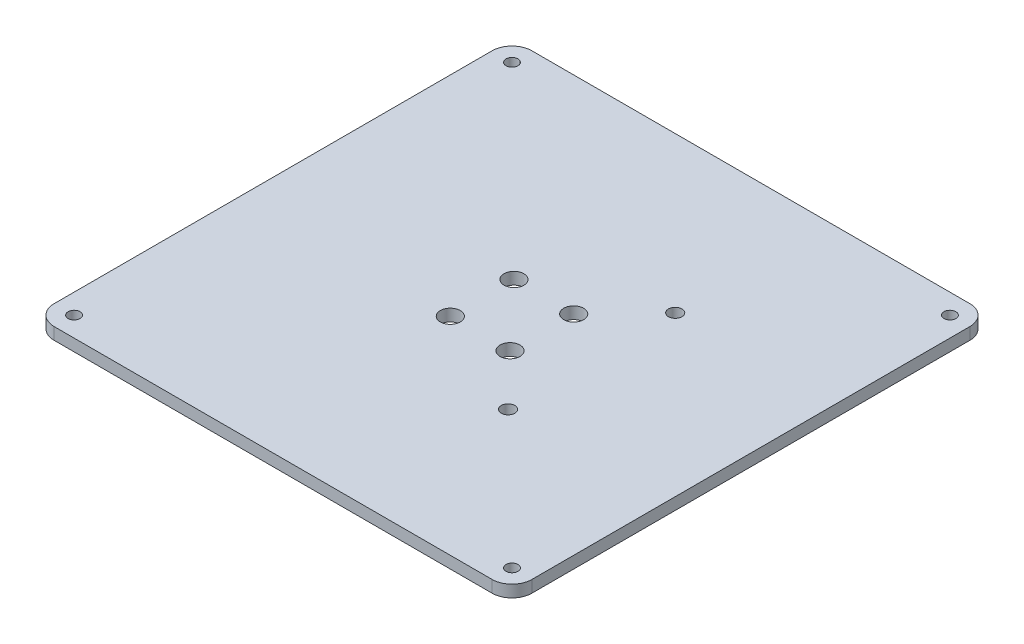
ISO-10303-21;
HEADER;
FILE_DESCRIPTION(('STEP AP214'),'2;1');
FILE_NAME('part.step','',(''),(''),'','','');
FILE_SCHEMA(('AUTOMOTIVE_DESIGN { 1 0 10303 214 1 1 1 1 }'));
ENDSEC;
DATA;
#1=APPLICATION_CONTEXT('core data for automotive mechanical design processes');
#2=APPLICATION_PROTOCOL_DEFINITION('international standard','automotive_design',2000,#1);
#3=PRODUCT_CONTEXT('',#1,'mechanical');
#4=PRODUCT('Part','Part','',(#3));
#5=PRODUCT_RELATED_PRODUCT_CATEGORY('part','',(#4));
#6=PRODUCT_DEFINITION_FORMATION('','',#4);
#7=PRODUCT_DEFINITION_CONTEXT('part definition',#1,'design');
#8=PRODUCT_DEFINITION('design','',#6,#7);
#9=PRODUCT_DEFINITION_SHAPE('','',#8);
#10=(LENGTH_UNIT() NAMED_UNIT(*) SI_UNIT(.MILLI.,.METRE.));
#11=(NAMED_UNIT(*) PLANE_ANGLE_UNIT() SI_UNIT($,.RADIAN.));
#12=(NAMED_UNIT(*) SI_UNIT($,.STERADIAN.) SOLID_ANGLE_UNIT());
#13=UNCERTAINTY_MEASURE_WITH_UNIT(LENGTH_MEASURE(1.E-05),#10,'distance_accuracy_value','');
#14=(GEOMETRIC_REPRESENTATION_CONTEXT(3) GLOBAL_UNCERTAINTY_ASSIGNED_CONTEXT((#13)) GLOBAL_UNIT_ASSIGNED_CONTEXT((#10,
#11,#12)) REPRESENTATION_CONTEXT('',''));
#15=CARTESIAN_POINT('',(0.,0.,0.));
#16=DIRECTION('',(0.,0.,1.));
#17=DIRECTION('',(1.,0.,0.));
#18=AXIS2_PLACEMENT_3D('',#15,#16,#17);
#19=CARTESIAN_POINT('',(0.,3.,0.));
#20=DIRECTION('',(0.,-1.,0.));
#21=DIRECTION('',(0.,0.,-1.));
#22=AXIS2_PLACEMENT_3D('',#19,#20,#21);
#23=PLANE('',#22);
#24=CARTESIAN_POINT('',(20.,3.,-21.));
#25=DIRECTION('',(0.,1.,0.));
#26=DIRECTION('',(0.,0.,1.));
#27=AXIS2_PLACEMENT_3D('',#24,#25,#26);
#28=CIRCLE('',#27,1.7);
#29=CARTESIAN_POINT('',(20.,3.,-19.3));
#30=VERTEX_POINT('',#29);
#31=EDGE_CURVE('E239',#30,#30,#28,.T.);
#32=ORIENTED_EDGE('',*,*,#31,.F.);
#33=EDGE_LOOP('',(#32));
#34=FACE_BOUND('',#33,.T.);
#35=CARTESIAN_POINT('',(20.,3.,21.));
#36=DIRECTION('',(0.,1.,0.));
#37=DIRECTION('',(0.,0.,1.));
#38=AXIS2_PLACEMENT_3D('',#35,#36,#37);
#39=CIRCLE('',#38,1.7);
#40=CARTESIAN_POINT('',(20.,3.,22.7));
#41=VERTEX_POINT('',#40);
#42=EDGE_CURVE('E236',#41,#41,#39,.T.);
#43=ORIENTED_EDGE('',*,*,#42,.F.);
#44=EDGE_LOOP('',(#43));
#45=FACE_BOUND('',#44,.T.);
#46=CARTESIAN_POINT('',(55.,3.,55.));
#47=DIRECTION('',(0.,1.,0.));
#48=DIRECTION('',(0.,0.,-1.));
#49=AXIS2_PLACEMENT_3D('',#46,#47,#48);
#50=CIRCLE('',#49,1.5);
#51=CARTESIAN_POINT('',(55.,3.,53.5));
#52=VERTEX_POINT('',#51);
#53=EDGE_CURVE('E227',#52,#52,#50,.T.);
#54=ORIENTED_EDGE('',*,*,#53,.F.);
#55=EDGE_LOOP('',(#54));
#56=FACE_BOUND('',#55,.T.);
#57=CARTESIAN_POINT('',(-55.,3.,55.));
#58=DIRECTION('',(0.,-1.,0.));
#59=DIRECTION('',(0.,0.,-1.));
#60=AXIS2_PLACEMENT_3D('',#57,#58,#59);
#61=CIRCLE('',#60,1.5);
#62=CARTESIAN_POINT('',(-55.,3.,53.5));
#63=VERTEX_POINT('',#62);
#64=EDGE_CURVE('E221',#63,#63,#61,.T.);
#65=ORIENTED_EDGE('',*,*,#64,.T.);
#66=EDGE_LOOP('',(#65));
#67=FACE_BOUND('',#66,.T.);
#68=CARTESIAN_POINT('',(55.,3.,-55.));
#69=DIRECTION('',(0.,-1.,0.));
#70=DIRECTION('',(0.,0.,1.));
#71=AXIS2_PLACEMENT_3D('',#68,#69,#70);
#72=CIRCLE('',#71,1.5);
#73=CARTESIAN_POINT('',(55.,3.,-53.5));
#74=VERTEX_POINT('',#73);
#75=EDGE_CURVE('E215',#74,#74,#72,.T.);
#76=ORIENTED_EDGE('',*,*,#75,.T.);
#77=EDGE_LOOP('',(#76));
#78=FACE_BOUND('',#77,.T.);
#79=CARTESIAN_POINT('',(-55.,3.,-55.));
#80=DIRECTION('',(0.,1.,0.));
#81=DIRECTION('',(0.,0.,1.));
#82=AXIS2_PLACEMENT_3D('',#79,#80,#81);
#83=CIRCLE('',#82,1.5);
#84=CARTESIAN_POINT('',(-55.,3.,-53.5));
#85=VERTEX_POINT('',#84);
#86=EDGE_CURVE('E209',#85,#85,#83,.T.);
#87=ORIENTED_EDGE('',*,*,#86,.F.);
#88=EDGE_LOOP('',(#87));
#89=FACE_BOUND('',#88,.T.);
#90=DIRECTION('',(-1.,0.,0.));
#91=VECTOR('',#90,1.);
#92=CARTESIAN_POINT('',(-60.,3.,-60.));
#93=LINE('',#92,#91);
#94=CARTESIAN_POINT('',(55.,3.,-60.));
#95=VERTEX_POINT('',#94);
#96=CARTESIAN_POINT('',(-55.,3.,-60.));
#97=VERTEX_POINT('',#96);
#98=EDGE_CURVE('E175',#95,#97,#93,.T.);
#99=ORIENTED_EDGE('',*,*,#98,.T.);
#100=CARTESIAN_POINT('',(-55.,3.,-55.));
#101=DIRECTION('',(0.,-1.,0.));
#102=DIRECTION('',(0.,0.,-1.));
#103=AXIS2_PLACEMENT_3D('',#100,#101,#102);
#104=CIRCLE('',#103,5.);
#105=CARTESIAN_POINT('',(-60.,3.,-55.));
#106=VERTEX_POINT('',#105);
#107=EDGE_CURVE('E153',#97,#106,#104,.F.);
#108=ORIENTED_EDGE('',*,*,#107,.T.);
#109=DIRECTION('',(0.,0.,1.));
#110=VECTOR('',#109,1.);
#111=CARTESIAN_POINT('',(-60.,3.,60.));
#112=LINE('',#111,#110);
#113=CARTESIAN_POINT('',(-60.,3.,55.));
#114=VERTEX_POINT('',#113);
#115=EDGE_CURVE('E123',#106,#114,#112,.T.);
#116=ORIENTED_EDGE('',*,*,#115,.T.);
#117=CARTESIAN_POINT('',(-55.,3.,55.));
#118=DIRECTION('',(0.,-1.,0.));
#119=DIRECTION('',(0.,0.,-1.));
#120=AXIS2_PLACEMENT_3D('',#117,#118,#119);
#121=CIRCLE('',#120,5.);
#122=CARTESIAN_POINT('',(-55.,3.,60.));
#123=VERTEX_POINT('',#122);
#124=EDGE_CURVE('E59',#114,#123,#121,.F.);
#125=ORIENTED_EDGE('',*,*,#124,.T.);
#126=DIRECTION('',(1.,0.,0.));
#127=VECTOR('',#126,1.);
#128=CARTESIAN_POINT('',(-60.,3.,60.));
#129=LINE('',#128,#127);
#130=CARTESIAN_POINT('',(55.,3.,60.));
#131=VERTEX_POINT('',#130);
#132=EDGE_CURVE('E139',#123,#131,#129,.T.);
#133=ORIENTED_EDGE('',*,*,#132,.T.);
#134=CARTESIAN_POINT('',(55.,3.,55.));
#135=DIRECTION('',(0.,-1.,0.));
#136=DIRECTION('',(0.,0.,-1.));
#137=AXIS2_PLACEMENT_3D('',#134,#135,#136);
#138=CIRCLE('',#137,5.);
#139=CARTESIAN_POINT('',(60.,3.,55.));
#140=VERTEX_POINT('',#139);
#141=EDGE_CURVE('E149',#131,#140,#138,.F.);
#142=ORIENTED_EDGE('',*,*,#141,.T.);
#143=DIRECTION('',(0.,0.,-1.));
#144=VECTOR('',#143,1.);
#145=CARTESIAN_POINT('',(60.,3.,60.));
#146=LINE('',#145,#144);
#147=CARTESIAN_POINT('',(60.,3.,-55.));
#148=VERTEX_POINT('',#147);
#149=EDGE_CURVE('E133',#140,#148,#146,.T.);
#150=ORIENTED_EDGE('',*,*,#149,.T.);
#151=CARTESIAN_POINT('',(55.,3.,-55.));
#152=DIRECTION('',(0.,-1.,0.));
#153=DIRECTION('',(0.,0.,-1.));
#154=AXIS2_PLACEMENT_3D('',#151,#152,#153);
#155=CIRCLE('',#154,5.);
#156=EDGE_CURVE('E151',#148,#95,#155,.F.);
#157=ORIENTED_EDGE('',*,*,#156,.T.);
#158=EDGE_LOOP('',(#99,#108,#116,#125,#133,#142,#150,#157));
#159=FACE_BOUND('',#158,.T.);
#160=CARTESIAN_POINT('',(-7.5,3.,8.));
#161=DIRECTION('',(0.,1.,0.));
#162=DIRECTION('',(0.,0.,1.));
#163=AXIS2_PLACEMENT_3D('',#160,#161,#162);
#164=CIRCLE('',#163,2.5);
#165=CARTESIAN_POINT('',(-7.5,3.,10.5));
#166=VERTEX_POINT('',#165);
#167=EDGE_CURVE('E184',#166,#166,#164,.T.);
#168=ORIENTED_EDGE('',*,*,#167,.F.);
#169=EDGE_LOOP('',(#168));
#170=FACE_BOUND('',#169,.T.);
#171=CARTESIAN_POINT('',(7.5,3.,-8.));
#172=DIRECTION('',(0.,1.,0.));
#173=DIRECTION('',(0.,0.,1.));
#174=AXIS2_PLACEMENT_3D('',#171,#172,#173);
#175=CIRCLE('',#174,2.5);
#176=CARTESIAN_POINT('',(7.5,3.,-5.5));
#177=VERTEX_POINT('',#176);
#178=EDGE_CURVE('E189',#177,#177,#175,.T.);
#179=ORIENTED_EDGE('',*,*,#178,.F.);
#180=EDGE_LOOP('',(#179));
#181=FACE_BOUND('',#180,.T.);
#182=CARTESIAN_POINT('',(7.5,3.,8.));
#183=DIRECTION('',(0.,1.,0.));
#184=DIRECTION('',(0.,0.,1.));
#185=AXIS2_PLACEMENT_3D('',#182,#183,#184);
#186=CIRCLE('',#185,2.5);
#187=CARTESIAN_POINT('',(7.5,3.,10.5));
#188=VERTEX_POINT('',#187);
#189=EDGE_CURVE('E194',#188,#188,#186,.T.);
#190=ORIENTED_EDGE('',*,*,#189,.F.);
#191=EDGE_LOOP('',(#190));
#192=FACE_BOUND('',#191,.T.);
#193=CARTESIAN_POINT('',(-7.5,3.,-8.));
#194=DIRECTION('',(0.,1.,0.));
#195=DIRECTION('',(0.,0.,1.));
#196=AXIS2_PLACEMENT_3D('',#193,#194,#195);
#197=CIRCLE('',#196,2.5);
#198=CARTESIAN_POINT('',(-7.5,3.,-5.5));
#199=VERTEX_POINT('',#198);
#200=EDGE_CURVE('E200',#199,#199,#197,.T.);
#201=ORIENTED_EDGE('',*,*,#200,.F.);
#202=EDGE_LOOP('',(#201));
#203=FACE_BOUND('',#202,.T.);
#204=ADVANCED_FACE('F39',(#34,#45,#56,#67,#78,#89,#159,#170,#181,#192,#203),#23,.F.);
#205=CARTESIAN_POINT('',(0.,0.,0.));
#206=DIRECTION('',(0.,-1.,0.));
#207=DIRECTION('',(0.,0.,-1.));
#208=AXIS2_PLACEMENT_3D('',#205,#206,#207);
#209=PLANE('',#208);
#210=CARTESIAN_POINT('',(20.,0.,-21.));
#211=DIRECTION('',(0.,1.,0.));
#212=DIRECTION('',(0.,0.,1.));
#213=AXIS2_PLACEMENT_3D('',#210,#211,#212);
#214=CIRCLE('',#213,1.7);
#215=CARTESIAN_POINT('',(20.,0.,-19.3));
#216=VERTEX_POINT('',#215);
#217=EDGE_CURVE('E230',#216,#216,#214,.T.);
#218=ORIENTED_EDGE('',*,*,#217,.T.);
#219=EDGE_LOOP('',(#218));
#220=FACE_BOUND('',#219,.T.);
#221=CARTESIAN_POINT('',(20.,0.,21.));
#222=DIRECTION('',(0.,1.,0.));
#223=DIRECTION('',(0.,0.,1.));
#224=AXIS2_PLACEMENT_3D('',#221,#222,#223);
#225=CIRCLE('',#224,1.7);
#226=CARTESIAN_POINT('',(20.,0.,22.7));
#227=VERTEX_POINT('',#226);
#228=EDGE_CURVE('E233',#227,#227,#225,.T.);
#229=ORIENTED_EDGE('',*,*,#228,.T.);
#230=EDGE_LOOP('',(#229));
#231=FACE_BOUND('',#230,.T.);
#232=CARTESIAN_POINT('',(55.,0.,55.));
#233=DIRECTION('',(0.,1.,0.));
#234=DIRECTION('',(0.,0.,-1.));
#235=AXIS2_PLACEMENT_3D('',#232,#233,#234);
#236=CIRCLE('',#235,1.5);
#237=CARTESIAN_POINT('',(55.,0.,53.5));
#238=VERTEX_POINT('',#237);
#239=EDGE_CURVE('E224',#238,#238,#236,.T.);
#240=ORIENTED_EDGE('',*,*,#239,.T.);
#241=EDGE_LOOP('',(#240));
#242=FACE_BOUND('',#241,.T.);
#243=CARTESIAN_POINT('',(-55.,0.,55.));
#244=DIRECTION('',(0.,-1.,0.));
#245=DIRECTION('',(0.,0.,-1.));
#246=AXIS2_PLACEMENT_3D('',#243,#244,#245);
#247=CIRCLE('',#246,1.5);
#248=CARTESIAN_POINT('',(-55.,0.,53.5));
#249=VERTEX_POINT('',#248);
#250=EDGE_CURVE('E218',#249,#249,#247,.T.);
#251=ORIENTED_EDGE('',*,*,#250,.F.);
#252=EDGE_LOOP('',(#251));
#253=FACE_BOUND('',#252,.T.);
#254=CARTESIAN_POINT('',(55.,0.,-55.));
#255=DIRECTION('',(0.,-1.,0.));
#256=DIRECTION('',(0.,0.,1.));
#257=AXIS2_PLACEMENT_3D('',#254,#255,#256);
#258=CIRCLE('',#257,1.5);
#259=CARTESIAN_POINT('',(55.,0.,-53.5));
#260=VERTEX_POINT('',#259);
#261=EDGE_CURVE('E212',#260,#260,#258,.T.);
#262=ORIENTED_EDGE('',*,*,#261,.F.);
#263=EDGE_LOOP('',(#262));
#264=FACE_BOUND('',#263,.T.);
#265=CARTESIAN_POINT('',(-55.,0.,-55.));
#266=DIRECTION('',(0.,1.,0.));
#267=DIRECTION('',(0.,0.,1.));
#268=AXIS2_PLACEMENT_3D('',#265,#266,#267);
#269=CIRCLE('',#268,1.5);
#270=CARTESIAN_POINT('',(-55.,0.,-53.5));
#271=VERTEX_POINT('',#270);
#272=EDGE_CURVE('E206',#271,#271,#269,.T.);
#273=ORIENTED_EDGE('',*,*,#272,.T.);
#274=EDGE_LOOP('',(#273));
#275=FACE_BOUND('',#274,.T.);
#276=CARTESIAN_POINT('',(7.5,0.,8.));
#277=DIRECTION('',(0.,1.,0.));
#278=DIRECTION('',(0.,0.,1.));
#279=AXIS2_PLACEMENT_3D('',#276,#277,#278);
#280=CIRCLE('',#279,2.5);
#281=CARTESIAN_POINT('',(7.5,0.,10.5));
#282=VERTEX_POINT('',#281);
#283=EDGE_CURVE('E197',#282,#282,#280,.T.);
#284=ORIENTED_EDGE('',*,*,#283,.T.);
#285=EDGE_LOOP('',(#284));
#286=FACE_BOUND('',#285,.T.);
#287=CARTESIAN_POINT('',(-7.5,0.,8.));
#288=DIRECTION('',(0.,1.,0.));
#289=DIRECTION('',(0.,0.,1.));
#290=AXIS2_PLACEMENT_3D('',#287,#288,#289);
#291=CIRCLE('',#290,2.5);
#292=CARTESIAN_POINT('',(-7.5,0.,10.5));
#293=VERTEX_POINT('',#292);
#294=EDGE_CURVE('E180',#293,#293,#291,.T.);
#295=ORIENTED_EDGE('',*,*,#294,.T.);
#296=EDGE_LOOP('',(#295));
#297=FACE_BOUND('',#296,.T.);
#298=DIRECTION('',(0.,0.,1.));
#299=VECTOR('',#298,1.);
#300=CARTESIAN_POINT('',(-60.,0.,60.));
#301=LINE('',#300,#299);
#302=CARTESIAN_POINT('',(-60.,0.,-55.));
#303=VERTEX_POINT('',#302);
#304=CARTESIAN_POINT('',(-60.,0.,55.));
#305=VERTEX_POINT('',#304);
#306=EDGE_CURVE('E121',#303,#305,#301,.T.);
#307=ORIENTED_EDGE('',*,*,#306,.F.);
#308=CARTESIAN_POINT('',(-55.,0.,-55.));
#309=DIRECTION('',(0.,-1.,0.));
#310=DIRECTION('',(0.,0.,-1.));
#311=AXIS2_PLACEMENT_3D('',#308,#309,#310);
#312=CIRCLE('',#311,5.);
#313=CARTESIAN_POINT('',(-55.,0.,-60.));
#314=VERTEX_POINT('',#313);
#315=EDGE_CURVE('E104',#303,#314,#312,.T.);
#316=ORIENTED_EDGE('',*,*,#315,.T.);
#317=DIRECTION('',(-1.,0.,0.));
#318=VECTOR('',#317,1.);
#319=CARTESIAN_POINT('',(-60.,0.,-60.));
#320=LINE('',#319,#318);
#321=CARTESIAN_POINT('',(55.,0.,-60.));
#322=VERTEX_POINT('',#321);
#323=EDGE_CURVE('E131',#322,#314,#320,.T.);
#324=ORIENTED_EDGE('',*,*,#323,.F.);
#325=CARTESIAN_POINT('',(55.,0.,-55.));
#326=DIRECTION('',(0.,-1.,0.));
#327=DIRECTION('',(0.,0.,-1.));
#328=AXIS2_PLACEMENT_3D('',#325,#326,#327);
#329=CIRCLE('',#328,5.);
#330=CARTESIAN_POINT('',(60.,0.,-55.));
#331=VERTEX_POINT('',#330);
#332=EDGE_CURVE('E115',#322,#331,#329,.T.);
#333=ORIENTED_EDGE('',*,*,#332,.T.);
#334=DIRECTION('',(0.,0.,-1.));
#335=VECTOR('',#334,1.);
#336=CARTESIAN_POINT('',(60.,0.,60.));
#337=LINE('',#336,#335);
#338=CARTESIAN_POINT('',(60.,0.,55.));
#339=VERTEX_POINT('',#338);
#340=EDGE_CURVE('E135',#339,#331,#337,.T.);
#341=ORIENTED_EDGE('',*,*,#340,.F.);
#342=CARTESIAN_POINT('',(55.,0.,55.));
#343=DIRECTION('',(0.,-1.,0.));
#344=DIRECTION('',(0.,0.,-1.));
#345=AXIS2_PLACEMENT_3D('',#342,#343,#344);
#346=CIRCLE('',#345,5.);
#347=CARTESIAN_POINT('',(55.,0.,60.));
#348=VERTEX_POINT('',#347);
#349=EDGE_CURVE('E142',#339,#348,#346,.T.);
#350=ORIENTED_EDGE('',*,*,#349,.T.);
#351=DIRECTION('',(1.,0.,0.));
#352=VECTOR('',#351,1.);
#353=CARTESIAN_POINT('',(-60.,0.,60.));
#354=LINE('',#353,#352);
#355=CARTESIAN_POINT('',(-55.,0.,60.));
#356=VERTEX_POINT('',#355);
#357=EDGE_CURVE('E130',#356,#348,#354,.T.);
#358=ORIENTED_EDGE('',*,*,#357,.F.);
#359=CARTESIAN_POINT('',(-55.,0.,55.));
#360=DIRECTION('',(0.,-1.,0.));
#361=DIRECTION('',(0.,0.,-1.));
#362=AXIS2_PLACEMENT_3D('',#359,#360,#361);
#363=CIRCLE('',#362,5.);
#364=EDGE_CURVE('E124',#356,#305,#363,.T.);
#365=ORIENTED_EDGE('',*,*,#364,.T.);
#366=EDGE_LOOP('',(#307,#316,#324,#333,#341,#350,#358,#365));
#367=FACE_BOUND('',#366,.T.);
#368=CARTESIAN_POINT('',(7.5,0.,-8.));
#369=DIRECTION('',(0.,1.,0.));
#370=DIRECTION('',(0.,0.,1.));
#371=AXIS2_PLACEMENT_3D('',#368,#369,#370);
#372=CIRCLE('',#371,2.5);
#373=CARTESIAN_POINT('',(7.5,0.,-5.5));
#374=VERTEX_POINT('',#373);
#375=EDGE_CURVE('E191',#374,#374,#372,.T.);
#376=ORIENTED_EDGE('',*,*,#375,.T.);
#377=EDGE_LOOP('',(#376));
#378=FACE_BOUND('',#377,.T.);
#379=CARTESIAN_POINT('',(-7.5,0.,-8.));
#380=DIRECTION('',(0.,1.,0.));
#381=DIRECTION('',(0.,0.,1.));
#382=AXIS2_PLACEMENT_3D('',#379,#380,#381);
#383=CIRCLE('',#382,2.5);
#384=CARTESIAN_POINT('',(-7.5,0.,-5.5));
#385=VERTEX_POINT('',#384);
#386=EDGE_CURVE('E203',#385,#385,#383,.T.);
#387=ORIENTED_EDGE('',*,*,#386,.T.);
#388=EDGE_LOOP('',(#387));
#389=FACE_BOUND('',#388,.T.);
#390=ADVANCED_FACE('F127',(#220,#231,#242,#253,#264,#275,#286,#297,#367,#378,#389),#209,.T.);
#391=CARTESIAN_POINT('',(60.,3.,60.));
#392=DIRECTION('',(-1.,0.,0.));
#393=DIRECTION('',(0.,0.,1.));
#394=AXIS2_PLACEMENT_3D('',#391,#392,#393);
#395=PLANE('',#394);
#396=ORIENTED_EDGE('',*,*,#340,.T.);
#397=DIRECTION('',(0.,-1.,0.));
#398=VECTOR('',#397,1.);
#399=CARTESIAN_POINT('',(60.,3.,-55.));
#400=LINE('',#399,#398);
#401=EDGE_CURVE('E158',#331,#148,#400,.F.);
#402=ORIENTED_EDGE('',*,*,#401,.T.);
#403=ORIENTED_EDGE('',*,*,#149,.F.);
#404=DIRECTION('',(0.,-1.,0.));
#405=VECTOR('',#404,1.);
#406=CARTESIAN_POINT('',(60.,3.,55.));
#407=LINE('',#406,#405);
#408=EDGE_CURVE('E155',#140,#339,#407,.T.);
#409=ORIENTED_EDGE('',*,*,#408,.T.);
#410=EDGE_LOOP('',(#396,#402,#403,#409));
#411=FACE_BOUND('',#410,.T.);
#412=ADVANCED_FACE('F171',(#411),#395,.F.);
#413=CARTESIAN_POINT('',(-60.,3.,-60.));
#414=DIRECTION('',(0.,0.,1.));
#415=DIRECTION('',(1.,0.,0.));
#416=AXIS2_PLACEMENT_3D('',#413,#414,#415);
#417=PLANE('',#416);
#418=ORIENTED_EDGE('',*,*,#323,.T.);
#419=DIRECTION('',(0.,-1.,0.));
#420=VECTOR('',#419,1.);
#421=CARTESIAN_POINT('',(-55.,3.,-60.));
#422=LINE('',#421,#420);
#423=EDGE_CURVE('E109',#314,#97,#422,.F.);
#424=ORIENTED_EDGE('',*,*,#423,.T.);
#425=ORIENTED_EDGE('',*,*,#98,.F.);
#426=DIRECTION('',(0.,-1.,0.));
#427=VECTOR('',#426,1.);
#428=CARTESIAN_POINT('',(55.,3.,-60.));
#429=LINE('',#428,#427);
#430=EDGE_CURVE('E114',#95,#322,#429,.T.);
#431=ORIENTED_EDGE('',*,*,#430,.T.);
#432=EDGE_LOOP('',(#418,#424,#425,#431));
#433=FACE_BOUND('',#432,.T.);
#434=ADVANCED_FACE('F288',(#433),#417,.F.);
#435=CARTESIAN_POINT('',(-60.,3.,60.));
#436=DIRECTION('',(1.,0.,0.));
#437=DIRECTION('',(0.,0.,-1.));
#438=AXIS2_PLACEMENT_3D('',#435,#436,#437);
#439=PLANE('',#438);
#440=ORIENTED_EDGE('',*,*,#115,.F.);
#441=DIRECTION('',(0.,-1.,0.));
#442=VECTOR('',#441,1.);
#443=CARTESIAN_POINT('',(-60.,3.,-55.));
#444=LINE('',#443,#442);
#445=EDGE_CURVE('E108',#106,#303,#444,.T.);
#446=ORIENTED_EDGE('',*,*,#445,.T.);
#447=ORIENTED_EDGE('',*,*,#306,.T.);
#448=DIRECTION('',(0.,-1.,0.));
#449=VECTOR('',#448,1.);
#450=CARTESIAN_POINT('',(-60.,3.,55.));
#451=LINE('',#450,#449);
#452=EDGE_CURVE('E125',#305,#114,#451,.F.);
#453=ORIENTED_EDGE('',*,*,#452,.T.);
#454=EDGE_LOOP('',(#440,#446,#447,#453));
#455=FACE_BOUND('',#454,.T.);
#456=ADVANCED_FACE('F120',(#455),#439,.F.);
#457=CARTESIAN_POINT('',(-60.,3.,60.));
#458=DIRECTION('',(0.,0.,-1.));
#459=DIRECTION('',(-1.,0.,0.));
#460=AXIS2_PLACEMENT_3D('',#457,#458,#459);
#461=PLANE('',#460);
#462=ORIENTED_EDGE('',*,*,#357,.T.);
#463=DIRECTION('',(0.,-1.,0.));
#464=VECTOR('',#463,1.);
#465=CARTESIAN_POINT('',(55.,3.,60.));
#466=LINE('',#465,#464);
#467=EDGE_CURVE('E11',#348,#131,#466,.F.);
#468=ORIENTED_EDGE('',*,*,#467,.T.);
#469=ORIENTED_EDGE('',*,*,#132,.F.);
#470=DIRECTION('',(0.,-1.,0.));
#471=VECTOR('',#470,1.);
#472=CARTESIAN_POINT('',(-55.,3.,60.));
#473=LINE('',#472,#471);
#474=EDGE_CURVE('E47',#123,#356,#473,.T.);
#475=ORIENTED_EDGE('',*,*,#474,.T.);
#476=EDGE_LOOP('',(#462,#468,#469,#475));
#477=FACE_BOUND('',#476,.T.);
#478=ADVANCED_FACE('F161',(#477),#461,.F.);
#479=CARTESIAN_POINT('',(-7.5,3.,8.));
#480=DIRECTION('',(0.,-1.,0.));
#481=DIRECTION('',(0.,0.,-1.));
#482=AXIS2_PLACEMENT_3D('',#479,#480,#481);
#483=CYLINDRICAL_SURFACE('',#482,2.5);
#484=ORIENTED_EDGE('',*,*,#167,.T.);
#485=EDGE_LOOP('',(#484));
#486=FACE_BOUND('',#485,.T.);
#487=ORIENTED_EDGE('',*,*,#294,.F.);
#488=EDGE_LOOP('',(#487));
#489=FACE_BOUND('',#488,.T.);
#490=ADVANCED_FACE('F294',(#486,#489),#483,.F.);
#491=CARTESIAN_POINT('',(7.5,3.,-8.));
#492=DIRECTION('',(0.,-1.,0.));
#493=DIRECTION('',(0.,0.,-1.));
#494=AXIS2_PLACEMENT_3D('',#491,#492,#493);
#495=CYLINDRICAL_SURFACE('',#494,2.5);
#496=ORIENTED_EDGE('',*,*,#178,.T.);
#497=EDGE_LOOP('',(#496));
#498=FACE_BOUND('',#497,.T.);
#499=ORIENTED_EDGE('',*,*,#375,.F.);
#500=EDGE_LOOP('',(#499));
#501=FACE_BOUND('',#500,.T.);
#502=ADVANCED_FACE('F328',(#498,#501),#495,.F.);
#503=CARTESIAN_POINT('',(7.5,3.,8.));
#504=DIRECTION('',(0.,-1.,0.));
#505=DIRECTION('',(0.,0.,-1.));
#506=AXIS2_PLACEMENT_3D('',#503,#504,#505);
#507=CYLINDRICAL_SURFACE('',#506,2.5);
#508=ORIENTED_EDGE('',*,*,#189,.T.);
#509=EDGE_LOOP('',(#508));
#510=FACE_BOUND('',#509,.T.);
#511=ORIENTED_EDGE('',*,*,#283,.F.);
#512=EDGE_LOOP('',(#511));
#513=FACE_BOUND('',#512,.T.);
#514=ADVANCED_FACE('F278',(#510,#513),#507,.F.);
#515=CARTESIAN_POINT('',(-7.5,3.,-8.));
#516=DIRECTION('',(0.,-1.,0.));
#517=DIRECTION('',(0.,0.,-1.));
#518=AXIS2_PLACEMENT_3D('',#515,#516,#517);
#519=CYLINDRICAL_SURFACE('',#518,2.5);
#520=ORIENTED_EDGE('',*,*,#200,.T.);
#521=EDGE_LOOP('',(#520));
#522=FACE_BOUND('',#521,.T.);
#523=ORIENTED_EDGE('',*,*,#386,.F.);
#524=EDGE_LOOP('',(#523));
#525=FACE_BOUND('',#524,.T.);
#526=ADVANCED_FACE('F275',(#522,#525),#519,.F.);
#527=CARTESIAN_POINT('',(-55.,3.,-55.));
#528=DIRECTION('',(0.,-1.,0.));
#529=DIRECTION('',(0.,0.,-1.));
#530=AXIS2_PLACEMENT_3D('',#527,#528,#529);
#531=CYLINDRICAL_SURFACE('',#530,5.);
#532=ORIENTED_EDGE('',*,*,#107,.F.);
#533=ORIENTED_EDGE('',*,*,#423,.F.);
#534=ORIENTED_EDGE('',*,*,#315,.F.);
#535=ORIENTED_EDGE('',*,*,#445,.F.);
#536=EDGE_LOOP('',(#532,#533,#534,#535));
#537=FACE_BOUND('',#536,.T.);
#538=ADVANCED_FACE('F107',(#537),#531,.T.);
#539=CARTESIAN_POINT('',(55.,3.,-55.));
#540=DIRECTION('',(0.,-1.,0.));
#541=DIRECTION('',(0.,0.,-1.));
#542=AXIS2_PLACEMENT_3D('',#539,#540,#541);
#543=CYLINDRICAL_SURFACE('',#542,5.);
#544=ORIENTED_EDGE('',*,*,#156,.F.);
#545=ORIENTED_EDGE('',*,*,#401,.F.);
#546=ORIENTED_EDGE('',*,*,#332,.F.);
#547=ORIENTED_EDGE('',*,*,#430,.F.);
#548=EDGE_LOOP('',(#544,#545,#546,#547));
#549=FACE_BOUND('',#548,.T.);
#550=ADVANCED_FACE('F302',(#549),#543,.T.);
#551=CARTESIAN_POINT('',(55.,3.,55.));
#552=DIRECTION('',(0.,-1.,0.));
#553=DIRECTION('',(0.,0.,-1.));
#554=AXIS2_PLACEMENT_3D('',#551,#552,#553);
#555=CYLINDRICAL_SURFACE('',#554,5.);
#556=ORIENTED_EDGE('',*,*,#141,.F.);
#557=ORIENTED_EDGE('',*,*,#467,.F.);
#558=ORIENTED_EDGE('',*,*,#349,.F.);
#559=ORIENTED_EDGE('',*,*,#408,.F.);
#560=EDGE_LOOP('',(#556,#557,#558,#559));
#561=FACE_BOUND('',#560,.T.);
#562=ADVANCED_FACE('F168',(#561),#555,.T.);
#563=CARTESIAN_POINT('',(-55.,3.,55.));
#564=DIRECTION('',(0.,-1.,0.));
#565=DIRECTION('',(0.,0.,-1.));
#566=AXIS2_PLACEMENT_3D('',#563,#564,#565);
#567=CYLINDRICAL_SURFACE('',#566,5.);
#568=ORIENTED_EDGE('',*,*,#124,.F.);
#569=ORIENTED_EDGE('',*,*,#452,.F.);
#570=ORIENTED_EDGE('',*,*,#364,.F.);
#571=ORIENTED_EDGE('',*,*,#474,.F.);
#572=EDGE_LOOP('',(#568,#569,#570,#571));
#573=FACE_BOUND('',#572,.T.);
#574=ADVANCED_FACE('F41',(#573),#567,.T.);
#575=CARTESIAN_POINT('',(-55.,0.,-55.));
#576=DIRECTION('',(0.,1.,0.));
#577=DIRECTION('',(0.,0.,1.));
#578=AXIS2_PLACEMENT_3D('',#575,#576,#577);
#579=CYLINDRICAL_SURFACE('',#578,1.5);
#580=ORIENTED_EDGE('',*,*,#272,.F.);
#581=EDGE_LOOP('',(#580));
#582=FACE_BOUND('',#581,.T.);
#583=ORIENTED_EDGE('',*,*,#86,.T.);
#584=EDGE_LOOP('',(#583));
#585=FACE_BOUND('',#584,.T.);
#586=ADVANCED_FACE('F309',(#582,#585),#579,.F.);
#587=CARTESIAN_POINT('',(55.,0.,-55.));
#588=DIRECTION('',(0.,1.,0.));
#589=DIRECTION('',(0.,0.,1.));
#590=AXIS2_PLACEMENT_3D('',#587,#588,#589);
#591=CYLINDRICAL_SURFACE('',#590,1.5);
#592=ORIENTED_EDGE('',*,*,#261,.T.);
#593=EDGE_LOOP('',(#592));
#594=FACE_BOUND('',#593,.T.);
#595=ORIENTED_EDGE('',*,*,#75,.F.);
#596=EDGE_LOOP('',(#595));
#597=FACE_BOUND('',#596,.T.);
#598=ADVANCED_FACE('F313',(#594,#597),#591,.F.);
#599=CARTESIAN_POINT('',(-55.,0.,55.));
#600=DIRECTION('',(0.,1.,0.));
#601=DIRECTION('',(0.,0.,1.));
#602=AXIS2_PLACEMENT_3D('',#599,#600,#601);
#603=CYLINDRICAL_SURFACE('',#602,1.5);
#604=ORIENTED_EDGE('',*,*,#250,.T.);
#605=EDGE_LOOP('',(#604));
#606=FACE_BOUND('',#605,.T.);
#607=ORIENTED_EDGE('',*,*,#64,.F.);
#608=EDGE_LOOP('',(#607));
#609=FACE_BOUND('',#608,.T.);
#610=ADVANCED_FACE('F319',(#606,#609),#603,.F.);
#611=CARTESIAN_POINT('',(55.,0.,55.));
#612=DIRECTION('',(0.,1.,0.));
#613=DIRECTION('',(0.,0.,1.));
#614=AXIS2_PLACEMENT_3D('',#611,#612,#613);
#615=CYLINDRICAL_SURFACE('',#614,1.5);
#616=ORIENTED_EDGE('',*,*,#239,.F.);
#617=EDGE_LOOP('',(#616));
#618=FACE_BOUND('',#617,.T.);
#619=ORIENTED_EDGE('',*,*,#53,.T.);
#620=EDGE_LOOP('',(#619));
#621=FACE_BOUND('',#620,.T.);
#622=ADVANCED_FACE('F393',(#618,#621),#615,.F.);
#623=CARTESIAN_POINT('',(20.,0.,21.));
#624=DIRECTION('',(0.,1.,0.));
#625=DIRECTION('',(0.,0.,1.));
#626=AXIS2_PLACEMENT_3D('',#623,#624,#625);
#627=CYLINDRICAL_SURFACE('',#626,1.7);
#628=ORIENTED_EDGE('',*,*,#228,.F.);
#629=EDGE_LOOP('',(#628));
#630=FACE_BOUND('',#629,.T.);
#631=ORIENTED_EDGE('',*,*,#42,.T.);
#632=EDGE_LOOP('',(#631));
#633=FACE_BOUND('',#632,.T.);
#634=ADVANCED_FACE('F250',(#630,#633),#627,.F.);
#635=CARTESIAN_POINT('',(20.,0.,-21.));
#636=DIRECTION('',(0.,1.,0.));
#637=DIRECTION('',(0.,0.,1.));
#638=AXIS2_PLACEMENT_3D('',#635,#636,#637);
#639=CYLINDRICAL_SURFACE('',#638,1.7);
#640=ORIENTED_EDGE('',*,*,#217,.F.);
#641=EDGE_LOOP('',(#640));
#642=FACE_BOUND('',#641,.T.);
#643=ORIENTED_EDGE('',*,*,#31,.T.);
#644=EDGE_LOOP('',(#643));
#645=FACE_BOUND('',#644,.T.);
#646=ADVANCED_FACE('F247',(#642,#645),#639,.F.);
#647=CLOSED_SHELL('',(#204,#390,#412,#434,#456,#478,#490,#502,#514,#526,#538,#550,#562,#574,
#586,#598,#610,#622,#634,#646));
#648=MANIFOLD_SOLID_BREP('B2',#647);
#649=ADVANCED_BREP_SHAPE_REPRESENTATION('',(#18,#648),#14);
#650=SHAPE_DEFINITION_REPRESENTATION(#9,#649);
ENDSEC;
END-ISO-10303-21;
